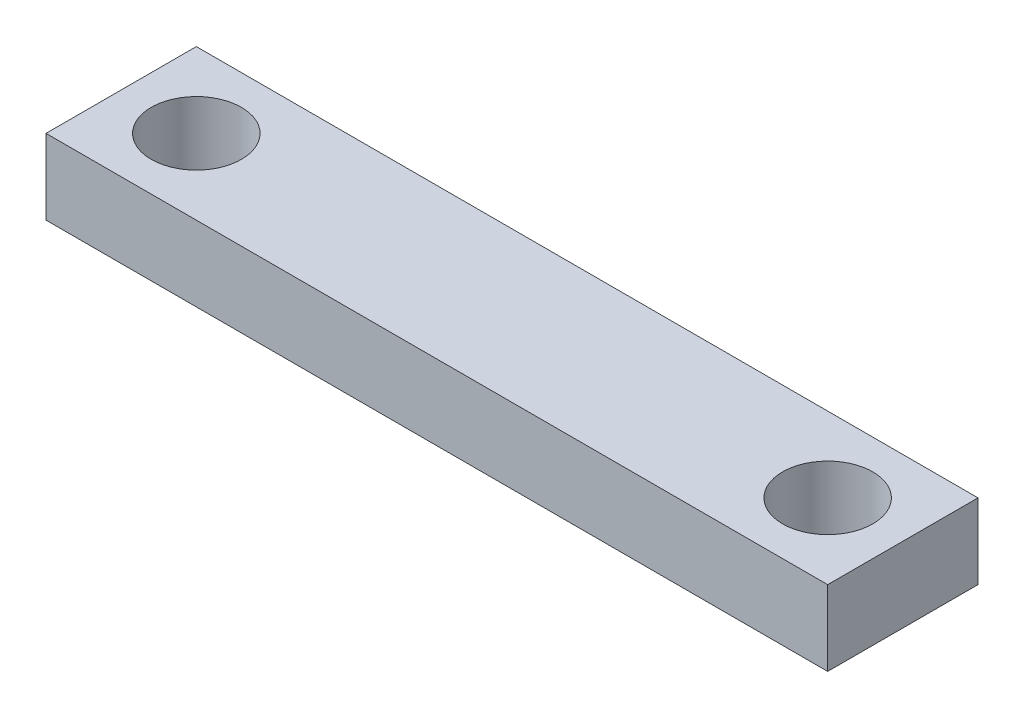
ISO-10303-21;
HEADER;
FILE_DESCRIPTION(('STEP AP214'),'2;1');
FILE_NAME('part.step','',(''),(''),'','','');
FILE_SCHEMA(('AUTOMOTIVE_DESIGN { 1 0 10303 214 1 1 1 1 }'));
ENDSEC;
DATA;
#1=APPLICATION_CONTEXT('core data for automotive mechanical design processes');
#2=APPLICATION_PROTOCOL_DEFINITION('international standard','automotive_design',2000,#1);
#3=PRODUCT_CONTEXT('',#1,'mechanical');
#4=PRODUCT('Part','Part','',(#3));
#5=PRODUCT_RELATED_PRODUCT_CATEGORY('part','',(#4));
#6=PRODUCT_DEFINITION_FORMATION('','',#4);
#7=PRODUCT_DEFINITION_CONTEXT('part definition',#1,'design');
#8=PRODUCT_DEFINITION('design','',#6,#7);
#9=PRODUCT_DEFINITION_SHAPE('','',#8);
#10=(LENGTH_UNIT() NAMED_UNIT(*) SI_UNIT(.MILLI.,.METRE.));
#11=(NAMED_UNIT(*) PLANE_ANGLE_UNIT() SI_UNIT($,.RADIAN.));
#12=(NAMED_UNIT(*) SI_UNIT($,.STERADIAN.) SOLID_ANGLE_UNIT());
#13=UNCERTAINTY_MEASURE_WITH_UNIT(LENGTH_MEASURE(1.E-05),#10,'distance_accuracy_value','');
#14=(GEOMETRIC_REPRESENTATION_CONTEXT(3) GLOBAL_UNCERTAINTY_ASSIGNED_CONTEXT((#13)) GLOBAL_UNIT_ASSIGNED_CONTEXT((#10,
#11,#12)) REPRESENTATION_CONTEXT('',''));
#15=CARTESIAN_POINT('',(0.,0.,0.));
#16=DIRECTION('',(0.,0.,1.));
#17=DIRECTION('',(1.,0.,0.));
#18=AXIS2_PLACEMENT_3D('',#15,#16,#17);
#19=CARTESIAN_POINT('',(0.,2.5,0.));
#20=DIRECTION('',(0.,-1.,0.));
#21=DIRECTION('',(0.,0.,-1.));
#22=AXIS2_PLACEMENT_3D('',#19,#20,#21);
#23=PLANE('',#22);
#24=DIRECTION('',(0.,0.,1.));
#25=VECTOR('',#24,1.);
#26=CARTESIAN_POINT('',(-26.,2.5,-5.));
#27=LINE('',#26,#25);
#28=CARTESIAN_POINT('',(-26.,2.5,-5.));
#29=VERTEX_POINT('',#28);
#30=CARTESIAN_POINT('',(-26.,2.5,5.));
#31=VERTEX_POINT('',#30);
#32=EDGE_CURVE('E85',#29,#31,#27,.T.);
#33=ORIENTED_EDGE('',*,*,#32,.T.);
#34=DIRECTION('',(1.,0.,0.));
#35=VECTOR('',#34,1.);
#36=CARTESIAN_POINT('',(26.,2.5,5.));
#37=LINE('',#36,#35);
#38=CARTESIAN_POINT('',(26.,2.5,5.));
#39=VERTEX_POINT('',#38);
#40=EDGE_CURVE('E80',#31,#39,#37,.T.);
#41=ORIENTED_EDGE('',*,*,#40,.T.);
#42=DIRECTION('',(0.,0.,-1.));
#43=VECTOR('',#42,1.);
#44=CARTESIAN_POINT('',(26.,2.5,-5.));
#45=LINE('',#44,#43);
#46=CARTESIAN_POINT('',(26.,2.5,-5.));
#47=VERTEX_POINT('',#46);
#48=EDGE_CURVE('E83',#39,#47,#45,.T.);
#49=ORIENTED_EDGE('',*,*,#48,.T.);
#50=DIRECTION('',(-1.,0.,0.));
#51=VECTOR('',#50,1.);
#52=CARTESIAN_POINT('',(26.,2.5,-5.));
#53=LINE('',#52,#51);
#54=EDGE_CURVE('E50',#47,#29,#53,.T.);
#55=ORIENTED_EDGE('',*,*,#54,.T.);
#56=EDGE_LOOP('',(#33,#41,#49,#55));
#57=FACE_BOUND('',#56,.T.);
#58=CARTESIAN_POINT('',(-21.,2.5,0.));
#59=DIRECTION('',(0.,1.,0.));
#60=DIRECTION('',(0.,0.,1.));
#61=AXIS2_PLACEMENT_3D('',#58,#59,#60);
#62=CIRCLE('',#61,2.99999999999999);
#63=CARTESIAN_POINT('',(-21.,2.5,2.99999999999999));
#64=VERTEX_POINT('',#63);
#65=EDGE_CURVE('E100',#64,#64,#62,.T.);
#66=ORIENTED_EDGE('',*,*,#65,.F.);
#67=EDGE_LOOP('',(#66));
#68=FACE_BOUND('',#67,.T.);
#69=CARTESIAN_POINT('',(21.,2.5,0.));
#70=DIRECTION('',(0.,1.,0.));
#71=DIRECTION('',(0.,0.,1.));
#72=AXIS2_PLACEMENT_3D('',#69,#70,#71);
#73=CIRCLE('',#72,2.99999999999999);
#74=CARTESIAN_POINT('',(21.,2.5,2.99999999999999));
#75=VERTEX_POINT('',#74);
#76=EDGE_CURVE('E115',#75,#75,#73,.T.);
#77=ORIENTED_EDGE('',*,*,#76,.F.);
#78=EDGE_LOOP('',(#77));
#79=FACE_BOUND('',#78,.T.);
#80=ADVANCED_FACE('F33',(#57,#68,#79),#23,.F.);
#81=CARTESIAN_POINT('',(0.,-2.5,0.));
#82=DIRECTION('',(0.,-1.,0.));
#83=DIRECTION('',(0.,0.,-1.));
#84=AXIS2_PLACEMENT_3D('',#81,#82,#83);
#85=PLANE('',#84);
#86=CARTESIAN_POINT('',(-21.,-2.5,0.));
#87=DIRECTION('',(0.,1.,0.));
#88=DIRECTION('',(0.,0.,1.));
#89=AXIS2_PLACEMENT_3D('',#86,#87,#88);
#90=CIRCLE('',#89,2.99999999999999);
#91=CARTESIAN_POINT('',(-21.,-2.5,2.99999999999999));
#92=VERTEX_POINT('',#91);
#93=EDGE_CURVE('E112',#92,#92,#90,.T.);
#94=ORIENTED_EDGE('',*,*,#93,.T.);
#95=EDGE_LOOP('',(#94));
#96=FACE_BOUND('',#95,.T.);
#97=DIRECTION('',(0.,0.,1.));
#98=VECTOR('',#97,1.);
#99=CARTESIAN_POINT('',(-26.,-2.5,-5.));
#100=LINE('',#99,#98);
#101=CARTESIAN_POINT('',(-26.,-2.5,-5.));
#102=VERTEX_POINT('',#101);
#103=CARTESIAN_POINT('',(-26.,-2.5,5.));
#104=VERTEX_POINT('',#103);
#105=EDGE_CURVE('E97',#102,#104,#100,.T.);
#106=ORIENTED_EDGE('',*,*,#105,.F.);
#107=DIRECTION('',(-1.,0.,0.));
#108=VECTOR('',#107,1.);
#109=CARTESIAN_POINT('',(26.,-2.5,-5.));
#110=LINE('',#109,#108);
#111=CARTESIAN_POINT('',(26.,-2.5,-5.));
#112=VERTEX_POINT('',#111);
#113=EDGE_CURVE('E73',#112,#102,#110,.T.);
#114=ORIENTED_EDGE('',*,*,#113,.F.);
#115=DIRECTION('',(0.,0.,-1.));
#116=VECTOR('',#115,1.);
#117=CARTESIAN_POINT('',(26.,-2.5,-5.));
#118=LINE('',#117,#116);
#119=CARTESIAN_POINT('',(26.,-2.5,5.));
#120=VERTEX_POINT('',#119);
#121=EDGE_CURVE('E67',#120,#112,#118,.T.);
#122=ORIENTED_EDGE('',*,*,#121,.F.);
#123=DIRECTION('',(1.,0.,0.));
#124=VECTOR('',#123,1.);
#125=CARTESIAN_POINT('',(26.,-2.5,5.));
#126=LINE('',#125,#124);
#127=EDGE_CURVE('E89',#104,#120,#126,.T.);
#128=ORIENTED_EDGE('',*,*,#127,.F.);
#129=EDGE_LOOP('',(#106,#114,#122,#128));
#130=FACE_BOUND('',#129,.T.);
#131=CARTESIAN_POINT('',(21.,-2.5,0.));
#132=DIRECTION('',(0.,1.,0.));
#133=DIRECTION('',(0.,0.,1.));
#134=AXIS2_PLACEMENT_3D('',#131,#132,#133);
#135=CIRCLE('',#134,2.99999999999999);
#136=CARTESIAN_POINT('',(21.,-2.5,2.99999999999999));
#137=VERTEX_POINT('',#136);
#138=EDGE_CURVE('E118',#137,#137,#135,.T.);
#139=ORIENTED_EDGE('',*,*,#138,.T.);
#140=EDGE_LOOP('',(#139));
#141=FACE_BOUND('',#140,.T.);
#142=ADVANCED_FACE('F108',(#96,#130,#141),#85,.T.);
#143=CARTESIAN_POINT('',(-26.,2.5,-5.));
#144=DIRECTION('',(1.,0.,0.));
#145=DIRECTION('',(0.,0.,-1.));
#146=AXIS2_PLACEMENT_3D('',#143,#144,#145);
#147=PLANE('',#146);
#148=ORIENTED_EDGE('',*,*,#105,.T.);
#149=DIRECTION('',(0.,-1.,0.));
#150=VECTOR('',#149,1.);
#151=CARTESIAN_POINT('',(-26.,2.5,5.));
#152=LINE('',#151,#150);
#153=EDGE_CURVE('E11',#31,#104,#152,.T.);
#154=ORIENTED_EDGE('',*,*,#153,.F.);
#155=ORIENTED_EDGE('',*,*,#32,.F.);
#156=DIRECTION('',(0.,-1.,0.));
#157=VECTOR('',#156,1.);
#158=CARTESIAN_POINT('',(-26.,2.5,-5.));
#159=LINE('',#158,#157);
#160=EDGE_CURVE('E93',#29,#102,#159,.T.);
#161=ORIENTED_EDGE('',*,*,#160,.T.);
#162=EDGE_LOOP('',(#148,#154,#155,#161));
#163=FACE_BOUND('',#162,.T.);
#164=ADVANCED_FACE('F35',(#163),#147,.F.);
#165=CARTESIAN_POINT('',(26.,2.5,5.));
#166=DIRECTION('',(0.,0.,-1.));
#167=DIRECTION('',(-1.,0.,0.));
#168=AXIS2_PLACEMENT_3D('',#165,#166,#167);
#169=PLANE('',#168);
#170=ORIENTED_EDGE('',*,*,#127,.T.);
#171=DIRECTION('',(0.,-1.,0.));
#172=VECTOR('',#171,1.);
#173=CARTESIAN_POINT('',(26.,2.5,5.));
#174=LINE('',#173,#172);
#175=EDGE_CURVE('E42',#39,#120,#174,.T.);
#176=ORIENTED_EDGE('',*,*,#175,.F.);
#177=ORIENTED_EDGE('',*,*,#40,.F.);
#178=ORIENTED_EDGE('',*,*,#153,.T.);
#179=EDGE_LOOP('',(#170,#176,#177,#178));
#180=FACE_BOUND('',#179,.T.);
#181=ADVANCED_FACE('F88',(#180),#169,.F.);
#182=CARTESIAN_POINT('',(26.,2.5,-5.));
#183=DIRECTION('',(-1.,0.,0.));
#184=DIRECTION('',(0.,0.,1.));
#185=AXIS2_PLACEMENT_3D('',#182,#183,#184);
#186=PLANE('',#185);
#187=ORIENTED_EDGE('',*,*,#121,.T.);
#188=DIRECTION('',(0.,-1.,0.));
#189=VECTOR('',#188,1.);
#190=CARTESIAN_POINT('',(26.,2.5,-5.));
#191=LINE('',#190,#189);
#192=EDGE_CURVE('E90',#47,#112,#191,.T.);
#193=ORIENTED_EDGE('',*,*,#192,.F.);
#194=ORIENTED_EDGE('',*,*,#48,.F.);
#195=ORIENTED_EDGE('',*,*,#175,.T.);
#196=EDGE_LOOP('',(#187,#193,#194,#195));
#197=FACE_BOUND('',#196,.T.);
#198=ADVANCED_FACE('F91',(#197),#186,.F.);
#199=CARTESIAN_POINT('',(26.,2.5,-5.));
#200=DIRECTION('',(0.,0.,1.));
#201=DIRECTION('',(1.,0.,0.));
#202=AXIS2_PLACEMENT_3D('',#199,#200,#201);
#203=PLANE('',#202);
#204=ORIENTED_EDGE('',*,*,#113,.T.);
#205=ORIENTED_EDGE('',*,*,#160,.F.);
#206=ORIENTED_EDGE('',*,*,#54,.F.);
#207=ORIENTED_EDGE('',*,*,#192,.T.);
#208=EDGE_LOOP('',(#204,#205,#206,#207));
#209=FACE_BOUND('',#208,.T.);
#210=ADVANCED_FACE('F105',(#209),#203,.F.);
#211=CARTESIAN_POINT('',(-21.,2.5,0.));
#212=DIRECTION('',(0.,-1.,0.));
#213=DIRECTION('',(0.,0.,-1.));
#214=AXIS2_PLACEMENT_3D('',#211,#212,#213);
#215=CYLINDRICAL_SURFACE('',#214,2.99999999999999);
#216=ORIENTED_EDGE('',*,*,#65,.T.);
#217=EDGE_LOOP('',(#216));
#218=FACE_BOUND('',#217,.T.);
#219=ORIENTED_EDGE('',*,*,#93,.F.);
#220=EDGE_LOOP('',(#219));
#221=FACE_BOUND('',#220,.T.);
#222=ADVANCED_FACE('F135',(#218,#221),#215,.F.);
#223=CARTESIAN_POINT('',(21.,2.5,0.));
#224=DIRECTION('',(0.,-1.,0.));
#225=DIRECTION('',(0.,0.,-1.));
#226=AXIS2_PLACEMENT_3D('',#223,#224,#225);
#227=CYLINDRICAL_SURFACE('',#226,2.99999999999999);
#228=ORIENTED_EDGE('',*,*,#76,.T.);
#229=EDGE_LOOP('',(#228));
#230=FACE_BOUND('',#229,.T.);
#231=ORIENTED_EDGE('',*,*,#138,.F.);
#232=EDGE_LOOP('',(#231));
#233=FACE_BOUND('',#232,.T.);
#234=ADVANCED_FACE('F124',(#230,#233),#227,.F.);
#235=CLOSED_SHELL('',(#80,#142,#164,#181,#198,#210,#222,#234));
#236=MANIFOLD_SOLID_BREP('B2',#235);
#237=ADVANCED_BREP_SHAPE_REPRESENTATION('',(#18,#236),#14);
#238=SHAPE_DEFINITION_REPRESENTATION(#9,#237);
ENDSEC;
END-ISO-10303-21;
